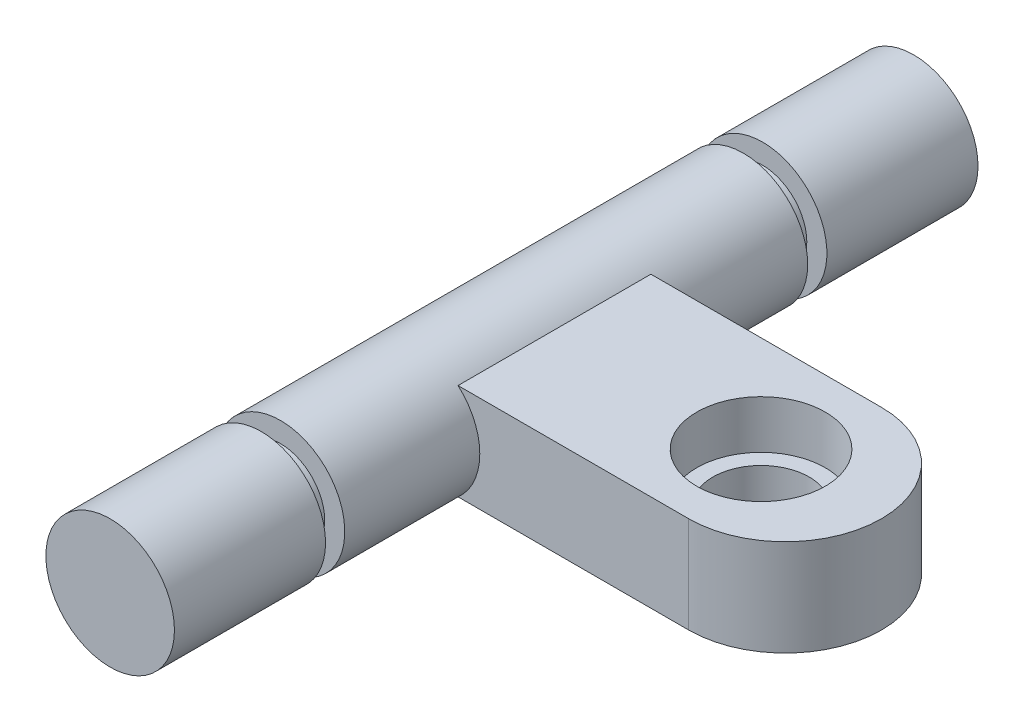
ISO-10303-21;
HEADER;
FILE_DESCRIPTION(('STEP AP214'),'2;1');
FILE_NAME('part.step','',(''),(''),'','','');
FILE_SCHEMA(('AUTOMOTIVE_DESIGN { 1 0 10303 214 1 1 1 1 }'));
ENDSEC;
DATA;
#1=APPLICATION_CONTEXT('core data for automotive mechanical design processes');
#2=APPLICATION_PROTOCOL_DEFINITION('international standard','automotive_design',2000,#1);
#3=PRODUCT_CONTEXT('',#1,'mechanical');
#4=PRODUCT('Part','Part','',(#3));
#5=PRODUCT_RELATED_PRODUCT_CATEGORY('part','',(#4));
#6=PRODUCT_DEFINITION_FORMATION('','',#4);
#7=PRODUCT_DEFINITION_CONTEXT('part definition',#1,'design');
#8=PRODUCT_DEFINITION('design','',#6,#7);
#9=PRODUCT_DEFINITION_SHAPE('','',#8);
#10=(LENGTH_UNIT() NAMED_UNIT(*) SI_UNIT(.MILLI.,.METRE.));
#11=(NAMED_UNIT(*) PLANE_ANGLE_UNIT() SI_UNIT($,.RADIAN.));
#12=(NAMED_UNIT(*) SI_UNIT($,.STERADIAN.) SOLID_ANGLE_UNIT());
#13=UNCERTAINTY_MEASURE_WITH_UNIT(LENGTH_MEASURE(1.E-05),#10,'distance_accuracy_value','');
#14=(GEOMETRIC_REPRESENTATION_CONTEXT(3) GLOBAL_UNCERTAINTY_ASSIGNED_CONTEXT((#13)) GLOBAL_UNIT_ASSIGNED_CONTEXT((#10,
#11,#12)) REPRESENTATION_CONTEXT('',''));
#15=CARTESIAN_POINT('',(0.,0.,0.));
#16=DIRECTION('',(0.,0.,1.));
#17=DIRECTION('',(1.,0.,0.));
#18=AXIS2_PLACEMENT_3D('',#15,#16,#17);
#19=CARTESIAN_POINT('',(-8.5,0.,25.));
#20=DIRECTION('',(0.,0.,-1.));
#21=DIRECTION('',(-1.,0.,0.));
#22=AXIS2_PLACEMENT_3D('',#19,#20,#21);
#23=CYLINDRICAL_SURFACE('',#22,4.);
#24=CARTESIAN_POINT('',(-8.5,0.,-14.402447519915));
#25=DIRECTION('',(0.,0.,1.));
#26=DIRECTION('',(1.,0.,0.));
#27=AXIS2_PLACEMENT_3D('',#24,#25,#26);
#28=CIRCLE('',#27,4.);
#29=CARTESIAN_POINT('',(-4.5,0.,-14.402447519915));
#30=VERTEX_POINT('',#29);
#31=EDGE_CURVE('E38',#30,#30,#28,.T.);
#32=ORIENTED_EDGE('',*,*,#31,.T.);
#33=EDGE_LOOP('',(#32));
#34=FACE_BOUND('',#33,.T.);
#35=DIRECTION('',(0.,0.,-1.));
#36=VECTOR('',#35,1.);
#37=CARTESIAN_POINT('',(-5.85424868893541,-3.,25.));
#38=LINE('',#37,#36);
#39=CARTESIAN_POINT('',(-5.85424868893541,-3.,6.));
#40=VERTEX_POINT('',#39);
#41=CARTESIAN_POINT('',(-5.85424868893541,-3.,-6.));
#42=VERTEX_POINT('',#41);
#43=EDGE_CURVE('E90',#40,#42,#38,.T.);
#44=ORIENTED_EDGE('',*,*,#43,.F.);
#45=CARTESIAN_POINT('',(-8.5,0.,6.));
#46=DIRECTION('',(0.,0.,-1.));
#47=DIRECTION('',(-1.,0.,0.));
#48=AXIS2_PLACEMENT_3D('',#45,#46,#47);
#49=CIRCLE('',#48,4.);
#50=CARTESIAN_POINT('',(-5.85424868893541,3.,6.));
#51=VERTEX_POINT('',#50);
#52=EDGE_CURVE('E58',#40,#51,#49,.F.);
#53=ORIENTED_EDGE('',*,*,#52,.T.);
#54=DIRECTION('',(0.,0.,-1.));
#55=VECTOR('',#54,1.);
#56=CARTESIAN_POINT('',(-5.85424868893541,3.,25.));
#57=LINE('',#56,#55);
#58=CARTESIAN_POINT('',(-5.85424868893541,3.,-6.));
#59=VERTEX_POINT('',#58);
#60=EDGE_CURVE('E51',#51,#59,#57,.T.);
#61=ORIENTED_EDGE('',*,*,#60,.T.);
#62=CARTESIAN_POINT('',(-8.5,0.,-6.));
#63=DIRECTION('',(0.,0.,1.));
#64=DIRECTION('',(1.,0.,0.));
#65=AXIS2_PLACEMENT_3D('',#62,#63,#64);
#66=CIRCLE('',#65,4.);
#67=EDGE_CURVE('E11',#59,#42,#66,.F.);
#68=ORIENTED_EDGE('',*,*,#67,.T.);
#69=EDGE_LOOP('',(#44,#53,#61,#68));
#70=FACE_BOUND('',#69,.T.);
#71=CARTESIAN_POINT('',(-8.5,0.,14.402447519915));
#72=DIRECTION('',(0.,0.,-1.));
#73=DIRECTION('',(-1.,0.,0.));
#74=AXIS2_PLACEMENT_3D('',#71,#72,#73);
#75=CIRCLE('',#74,4.);
#76=CARTESIAN_POINT('',(-12.5,0.,14.402447519915));
#77=VERTEX_POINT('',#76);
#78=EDGE_CURVE('E126',#77,#77,#75,.T.);
#79=ORIENTED_EDGE('',*,*,#78,.T.);
#80=EDGE_LOOP('',(#79));
#81=FACE_BOUND('',#80,.T.);
#82=ADVANCED_FACE('F34',(#34,#70,#81),#23,.T.);
#83=CARTESIAN_POINT('',(8.5,3.,0.));
#84=DIRECTION('',(0.,-1.,0.));
#85=DIRECTION('',(0.,0.,-1.));
#86=AXIS2_PLACEMENT_3D('',#83,#84,#85);
#87=PLANE('',#86);
#88=CARTESIAN_POINT('',(7.,3.,0.));
#89=DIRECTION('',(0.,1.,0.));
#90=DIRECTION('',(0.,0.,1.));
#91=AXIS2_PLACEMENT_3D('',#88,#89,#90);
#92=CIRCLE('',#91,4.);
#93=CARTESIAN_POINT('',(7.,3.,4.));
#94=VERTEX_POINT('',#93);
#95=EDGE_CURVE('E98',#94,#94,#92,.T.);
#96=ORIENTED_EDGE('',*,*,#95,.F.);
#97=EDGE_LOOP('',(#96));
#98=FACE_BOUND('',#97,.T.);
#99=ORIENTED_EDGE('',*,*,#60,.F.);
#100=DIRECTION('',(1.,0.,0.));
#101=VECTOR('',#100,1.);
#102=CARTESIAN_POINT('',(8.5,3.,6.));
#103=LINE('',#102,#101);
#104=CARTESIAN_POINT('',(8.5,3.,6.));
#105=VERTEX_POINT('',#104);
#106=EDGE_CURVE('E86',#51,#105,#103,.T.);
#107=ORIENTED_EDGE('',*,*,#106,.T.);
#108=CARTESIAN_POINT('',(8.5,3.,0.));
#109=DIRECTION('',(0.,1.,0.));
#110=DIRECTION('',(0.,0.,-1.));
#111=AXIS2_PLACEMENT_3D('',#108,#109,#110);
#112=CIRCLE('',#111,6.);
#113=CARTESIAN_POINT('',(8.5,3.,-6.));
#114=VERTEX_POINT('',#113);
#115=EDGE_CURVE('E112',#105,#114,#112,.T.);
#116=ORIENTED_EDGE('',*,*,#115,.T.);
#117=DIRECTION('',(-1.,0.,0.));
#118=VECTOR('',#117,1.);
#119=CARTESIAN_POINT('',(8.5,3.,-6.));
#120=LINE('',#119,#118);
#121=EDGE_CURVE('E114',#114,#59,#120,.T.);
#122=ORIENTED_EDGE('',*,*,#121,.T.);
#123=EDGE_LOOP('',(#99,#107,#116,#122));
#124=FACE_BOUND('',#123,.T.);
#125=ADVANCED_FACE('F173',(#98,#124),#87,.F.);
#126=CARTESIAN_POINT('',(8.5,-3.,0.));
#127=DIRECTION('',(0.,-1.,0.));
#128=DIRECTION('',(0.,0.,-1.));
#129=AXIS2_PLACEMENT_3D('',#126,#127,#128);
#130=PLANE('',#129);
#131=CARTESIAN_POINT('',(7.,-3.,0.));
#132=DIRECTION('',(0.,1.,0.));
#133=DIRECTION('',(0.,0.,1.));
#134=AXIS2_PLACEMENT_3D('',#131,#132,#133);
#135=CIRCLE('',#134,3.);
#136=CARTESIAN_POINT('',(7.,-3.,3.));
#137=VERTEX_POINT('',#136);
#138=EDGE_CURVE('E108',#137,#137,#135,.T.);
#139=ORIENTED_EDGE('',*,*,#138,.T.);
#140=EDGE_LOOP('',(#139));
#141=FACE_BOUND('',#140,.T.);
#142=DIRECTION('',(1.,0.,0.));
#143=VECTOR('',#142,1.);
#144=CARTESIAN_POINT('',(8.5,-3.,6.));
#145=LINE('',#144,#143);
#146=CARTESIAN_POINT('',(8.5,-3.,6.));
#147=VERTEX_POINT('',#146);
#148=EDGE_CURVE('E92',#40,#147,#145,.T.);
#149=ORIENTED_EDGE('',*,*,#148,.F.);
#150=ORIENTED_EDGE('',*,*,#43,.T.);
#151=DIRECTION('',(-1.,0.,0.));
#152=VECTOR('',#151,1.);
#153=CARTESIAN_POINT('',(8.5,-3.,-6.));
#154=LINE('',#153,#152);
#155=CARTESIAN_POINT('',(8.5,-3.,-6.));
#156=VERTEX_POINT('',#155);
#157=EDGE_CURVE('E78',#156,#42,#154,.T.);
#158=ORIENTED_EDGE('',*,*,#157,.F.);
#159=CARTESIAN_POINT('',(8.5,-3.,0.));
#160=DIRECTION('',(0.,1.,0.));
#161=DIRECTION('',(0.,0.,-1.));
#162=AXIS2_PLACEMENT_3D('',#159,#160,#161);
#163=CIRCLE('',#162,6.);
#164=EDGE_CURVE('E87',#147,#156,#163,.T.);
#165=ORIENTED_EDGE('',*,*,#164,.F.);
#166=EDGE_LOOP('',(#149,#150,#158,#165));
#167=FACE_BOUND('',#166,.T.);
#168=ADVANCED_FACE('F91',(#141,#167),#130,.T.);
#169=CARTESIAN_POINT('',(7.,3.,0.));
#170=DIRECTION('',(0.,-1.,0.));
#171=DIRECTION('',(0.,0.,-1.));
#172=AXIS2_PLACEMENT_3D('',#169,#170,#171);
#173=CYLINDRICAL_SURFACE('',#172,3.);
#174=ORIENTED_EDGE('',*,*,#138,.F.);
#175=EDGE_LOOP('',(#174));
#176=FACE_BOUND('',#175,.T.);
#177=CARTESIAN_POINT('',(7.,0.,0.));
#178=DIRECTION('',(0.,1.,0.));
#179=DIRECTION('',(0.,0.,1.));
#180=AXIS2_PLACEMENT_3D('',#177,#178,#179);
#181=CIRCLE('',#180,3.);
#182=CARTESIAN_POINT('',(7.,0.,3.));
#183=VERTEX_POINT('',#182);
#184=EDGE_CURVE('E105',#183,#183,#181,.T.);
#185=ORIENTED_EDGE('',*,*,#184,.T.);
#186=EDGE_LOOP('',(#185));
#187=FACE_BOUND('',#186,.T.);
#188=ADVANCED_FACE('F231',(#176,#187),#173,.F.);
#189=CARTESIAN_POINT('',(8.5,3.,6.));
#190=DIRECTION('',(0.,0.,-1.));
#191=DIRECTION('',(-1.,0.,0.));
#192=AXIS2_PLACEMENT_3D('',#189,#190,#191);
#193=PLANE('',#192);
#194=ORIENTED_EDGE('',*,*,#52,.F.);
#195=ORIENTED_EDGE('',*,*,#148,.T.);
#196=DIRECTION('',(0.,-1.,0.));
#197=VECTOR('',#196,1.);
#198=CARTESIAN_POINT('',(8.5,3.,6.));
#199=LINE('',#198,#197);
#200=EDGE_CURVE('E43',#105,#147,#199,.T.);
#201=ORIENTED_EDGE('',*,*,#200,.F.);
#202=ORIENTED_EDGE('',*,*,#106,.F.);
#203=EDGE_LOOP('',(#194,#195,#201,#202));
#204=FACE_BOUND('',#203,.T.);
#205=ADVANCED_FACE('F36',(#204),#193,.F.);
#206=CARTESIAN_POINT('',(8.5,3.,0.));
#207=DIRECTION('',(0.,-1.,0.));
#208=DIRECTION('',(0.,0.,-1.));
#209=AXIS2_PLACEMENT_3D('',#206,#207,#208);
#210=CYLINDRICAL_SURFACE('',#209,6.);
#211=ORIENTED_EDGE('',*,*,#164,.T.);
#212=DIRECTION('',(0.,-1.,0.));
#213=VECTOR('',#212,1.);
#214=CARTESIAN_POINT('',(8.5,3.,-6.));
#215=LINE('',#214,#213);
#216=EDGE_CURVE('E83',#114,#156,#215,.T.);
#217=ORIENTED_EDGE('',*,*,#216,.F.);
#218=ORIENTED_EDGE('',*,*,#115,.F.);
#219=ORIENTED_EDGE('',*,*,#200,.T.);
#220=EDGE_LOOP('',(#211,#217,#218,#219));
#221=FACE_BOUND('',#220,.T.);
#222=ADVANCED_FACE('F239',(#221),#210,.T.);
#223=CARTESIAN_POINT('',(8.5,3.,-6.));
#224=DIRECTION('',(0.,0.,1.));
#225=DIRECTION('',(1.,0.,0.));
#226=AXIS2_PLACEMENT_3D('',#223,#224,#225);
#227=PLANE('',#226);
#228=ORIENTED_EDGE('',*,*,#67,.F.);
#229=ORIENTED_EDGE('',*,*,#121,.F.);
#230=ORIENTED_EDGE('',*,*,#216,.T.);
#231=ORIENTED_EDGE('',*,*,#157,.T.);
#232=EDGE_LOOP('',(#228,#229,#230,#231));
#233=FACE_BOUND('',#232,.T.);
#234=ADVANCED_FACE('F80',(#233),#227,.F.);
#235=CARTESIAN_POINT('',(7.,0.,0.));
#236=DIRECTION('',(0.,1.,0.));
#237=DIRECTION('',(0.,0.,1.));
#238=AXIS2_PLACEMENT_3D('',#235,#236,#237);
#239=CYLINDRICAL_SURFACE('',#238,4.);
#240=CARTESIAN_POINT('',(7.,0.,0.));
#241=DIRECTION('',(0.,1.,0.));
#242=DIRECTION('',(0.,0.,1.));
#243=AXIS2_PLACEMENT_3D('',#240,#241,#242);
#244=CIRCLE('',#243,4.);
#245=CARTESIAN_POINT('',(7.,0.,4.));
#246=VERTEX_POINT('',#245);
#247=EDGE_CURVE('E102',#246,#246,#244,.T.);
#248=ORIENTED_EDGE('',*,*,#247,.F.);
#249=EDGE_LOOP('',(#248));
#250=FACE_BOUND('',#249,.T.);
#251=ORIENTED_EDGE('',*,*,#95,.T.);
#252=EDGE_LOOP('',(#251));
#253=FACE_BOUND('',#252,.T.);
#254=ADVANCED_FACE('F221',(#250,#253),#239,.F.);
#255=CARTESIAN_POINT('',(7.,0.,0.));
#256=DIRECTION('',(0.,1.,0.));
#257=DIRECTION('',(0.,0.,1.));
#258=AXIS2_PLACEMENT_3D('',#255,#256,#257);
#259=PLANE('',#258);
#260=ORIENTED_EDGE('',*,*,#184,.F.);
#261=EDGE_LOOP('',(#260));
#262=FACE_BOUND('',#261,.T.);
#263=ORIENTED_EDGE('',*,*,#247,.T.);
#264=EDGE_LOOP('',(#263));
#265=FACE_BOUND('',#264,.T.);
#266=ADVANCED_FACE('F210',(#262,#265),#259,.T.);
#267=CARTESIAN_POINT('',(-3.24999999999999,0.,14.402447519915));
#268=DIRECTION('',(0.,0.,-1.));
#269=DIRECTION('',(-1.,0.,0.));
#270=AXIS2_PLACEMENT_3D('',#267,#268,#269);
#271=PLANE('',#270);
#272=CARTESIAN_POINT('',(-8.5,0.,14.402447519915));
#273=DIRECTION('',(0.,0.,1.));
#274=DIRECTION('',(1.,0.,0.));
#275=AXIS2_PLACEMENT_3D('',#272,#273,#274);
#276=CIRCLE('',#275,2.75);
#277=CARTESIAN_POINT('',(-5.75,0.,14.402447519915));
#278=VERTEX_POINT('',#277);
#279=EDGE_CURVE('E143',#278,#278,#276,.T.);
#280=ORIENTED_EDGE('',*,*,#279,.F.);
#281=EDGE_LOOP('',(#280));
#282=FACE_BOUND('',#281,.T.);
#283=ORIENTED_EDGE('',*,*,#78,.F.);
#284=EDGE_LOOP('',(#283));
#285=FACE_BOUND('',#284,.T.);
#286=ADVANCED_FACE('F201',(#282,#285),#271,.F.);
#287=CARTESIAN_POINT('',(-3.24999999999999,0.,15.597552480085));
#288=DIRECTION('',(0.,0.,1.));
#289=DIRECTION('',(1.,0.,0.));
#290=AXIS2_PLACEMENT_3D('',#287,#288,#289);
#291=PLANE('',#290);
#292=CARTESIAN_POINT('',(-8.5,0.,15.597552480085));
#293=DIRECTION('',(0.,0.,1.));
#294=DIRECTION('',(1.,0.,0.));
#295=AXIS2_PLACEMENT_3D('',#292,#293,#294);
#296=CIRCLE('',#295,2.75);
#297=CARTESIAN_POINT('',(-5.75,0.,15.597552480085));
#298=VERTEX_POINT('',#297);
#299=EDGE_CURVE('E147',#298,#298,#296,.T.);
#300=ORIENTED_EDGE('',*,*,#299,.T.);
#301=EDGE_LOOP('',(#300));
#302=FACE_BOUND('',#301,.T.);
#303=CARTESIAN_POINT('',(-8.5,0.,15.597552480085));
#304=DIRECTION('',(0.,0.,1.));
#305=DIRECTION('',(1.,0.,0.));
#306=AXIS2_PLACEMENT_3D('',#303,#304,#305);
#307=CIRCLE('',#306,4.);
#308=CARTESIAN_POINT('',(-4.5,0.,15.597552480085));
#309=VERTEX_POINT('',#308);
#310=EDGE_CURVE('E123',#309,#309,#307,.T.);
#311=ORIENTED_EDGE('',*,*,#310,.F.);
#312=EDGE_LOOP('',(#311));
#313=FACE_BOUND('',#312,.T.);
#314=ADVANCED_FACE('F199',(#302,#313),#291,.F.);
#315=CARTESIAN_POINT('',(-8.5,0.,25.));
#316=DIRECTION('',(0.,0.,1.));
#317=DIRECTION('',(1.,0.,0.));
#318=AXIS2_PLACEMENT_3D('',#315,#316,#317);
#319=CYLINDRICAL_SURFACE('',#318,2.75);
#320=ORIENTED_EDGE('',*,*,#299,.F.);
#321=EDGE_LOOP('',(#320));
#322=FACE_BOUND('',#321,.T.);
#323=ORIENTED_EDGE('',*,*,#279,.T.);
#324=EDGE_LOOP('',(#323));
#325=FACE_BOUND('',#324,.T.);
#326=ADVANCED_FACE('F169',(#322,#325),#319,.T.);
#327=CARTESIAN_POINT('',(-3.25,0.,-14.402447519915));
#328=DIRECTION('',(0.,0.,1.));
#329=DIRECTION('',(1.,0.,0.));
#330=AXIS2_PLACEMENT_3D('',#327,#328,#329);
#331=PLANE('',#330);
#332=CARTESIAN_POINT('',(-8.5,0.,-14.402447519915));
#333=DIRECTION('',(0.,0.,1.));
#334=DIRECTION('',(1.,0.,0.));
#335=AXIS2_PLACEMENT_3D('',#332,#333,#334);
#336=CIRCLE('',#335,2.75);
#337=CARTESIAN_POINT('',(-5.75,0.,-14.402447519915));
#338=VERTEX_POINT('',#337);
#339=EDGE_CURVE('E127',#338,#338,#336,.T.);
#340=ORIENTED_EDGE('',*,*,#339,.T.);
#341=EDGE_LOOP('',(#340));
#342=FACE_BOUND('',#341,.T.);
#343=ORIENTED_EDGE('',*,*,#31,.F.);
#344=EDGE_LOOP('',(#343));
#345=FACE_BOUND('',#344,.T.);
#346=ADVANCED_FACE('F160',(#342,#345),#331,.F.);
#347=CARTESIAN_POINT('',(-3.24999999999999,0.,-15.597552480085));
#348=DIRECTION('',(0.,0.,-1.));
#349=DIRECTION('',(-1.,0.,0.));
#350=AXIS2_PLACEMENT_3D('',#347,#348,#349);
#351=PLANE('',#350);
#352=CARTESIAN_POINT('',(-8.5,0.,-15.597552480085));
#353=DIRECTION('',(0.,0.,1.));
#354=DIRECTION('',(1.,0.,0.));
#355=AXIS2_PLACEMENT_3D('',#352,#353,#354);
#356=CIRCLE('',#355,2.74999999999999);
#357=CARTESIAN_POINT('',(-5.75000000000001,0.,-15.597552480085));
#358=VERTEX_POINT('',#357);
#359=EDGE_CURVE('E146',#358,#358,#356,.T.);
#360=ORIENTED_EDGE('',*,*,#359,.F.);
#361=EDGE_LOOP('',(#360));
#362=FACE_BOUND('',#361,.T.);
#363=CARTESIAN_POINT('',(-8.5,0.,-15.597552480085));
#364=DIRECTION('',(0.,0.,-1.));
#365=DIRECTION('',(-1.,0.,0.));
#366=AXIS2_PLACEMENT_3D('',#363,#364,#365);
#367=CIRCLE('',#366,4.);
#368=CARTESIAN_POINT('',(-12.5,0.,-15.597552480085));
#369=VERTEX_POINT('',#368);
#370=EDGE_CURVE('E129',#369,#369,#367,.T.);
#371=ORIENTED_EDGE('',*,*,#370,.F.);
#372=EDGE_LOOP('',(#371));
#373=FACE_BOUND('',#372,.T.);
#374=ADVANCED_FACE('F157',(#362,#373),#351,.F.);
#375=CARTESIAN_POINT('',(-8.5,0.,25.));
#376=DIRECTION('',(0.,0.,1.));
#377=DIRECTION('',(1.,0.,0.));
#378=AXIS2_PLACEMENT_3D('',#375,#376,#377);
#379=CYLINDRICAL_SURFACE('',#378,2.75);
#380=ORIENTED_EDGE('',*,*,#339,.F.);
#381=EDGE_LOOP('',(#380));
#382=FACE_BOUND('',#381,.T.);
#383=ORIENTED_EDGE('',*,*,#359,.T.);
#384=EDGE_LOOP('',(#383));
#385=FACE_BOUND('',#384,.T.);
#386=ADVANCED_FACE('F155',(#382,#385),#379,.T.);
#387=CARTESIAN_POINT('',(-8.5,0.,25.));
#388=DIRECTION('',(0.,0.,1.));
#389=DIRECTION('',(1.,0.,0.));
#390=AXIS2_PLACEMENT_3D('',#387,#388,#389);
#391=PLANE('',#390);
#392=CARTESIAN_POINT('',(-8.5,0.,25.));
#393=DIRECTION('',(0.,0.,1.));
#394=DIRECTION('',(1.,0.,0.));
#395=AXIS2_PLACEMENT_3D('',#392,#393,#394);
#396=CIRCLE('',#395,4.);
#397=CARTESIAN_POINT('',(-4.5,0.,25.));
#398=VERTEX_POINT('',#397);
#399=EDGE_CURVE('E94',#398,#398,#396,.T.);
#400=ORIENTED_EDGE('',*,*,#399,.T.);
#401=EDGE_LOOP('',(#400));
#402=FACE_BOUND('',#401,.T.);
#403=ADVANCED_FACE('F166',(#402),#391,.T.);
#404=ORIENTED_EDGE('',*,*,#310,.T.);
#405=EDGE_LOOP('',(#404));
#406=FACE_BOUND('',#405,.T.);
#407=ORIENTED_EDGE('',*,*,#399,.F.);
#408=EDGE_LOOP('',(#407));
#409=FACE_BOUND('',#408,.T.);
#410=ADVANCED_FACE('F176',(#406,#409),#23,.T.);
#411=CARTESIAN_POINT('',(-8.5,0.,-25.));
#412=DIRECTION('',(0.,0.,1.));
#413=DIRECTION('',(1.,0.,0.));
#414=AXIS2_PLACEMENT_3D('',#411,#412,#413);
#415=PLANE('',#414);
#416=CARTESIAN_POINT('',(-8.5,0.,-25.));
#417=DIRECTION('',(0.,0.,1.));
#418=DIRECTION('',(1.,0.,0.));
#419=AXIS2_PLACEMENT_3D('',#416,#417,#418);
#420=CIRCLE('',#419,4.);
#421=CARTESIAN_POINT('',(-4.5,0.,-25.));
#422=VERTEX_POINT('',#421);
#423=EDGE_CURVE('E134',#422,#422,#420,.T.);
#424=ORIENTED_EDGE('',*,*,#423,.F.);
#425=EDGE_LOOP('',(#424));
#426=FACE_BOUND('',#425,.T.);
#427=ADVANCED_FACE('F185',(#426),#415,.F.);
#428=ORIENTED_EDGE('',*,*,#370,.T.);
#429=EDGE_LOOP('',(#428));
#430=FACE_BOUND('',#429,.T.);
#431=ORIENTED_EDGE('',*,*,#423,.T.);
#432=EDGE_LOOP('',(#431));
#433=FACE_BOUND('',#432,.T.);
#434=ADVANCED_FACE('F175',(#430,#433),#23,.T.);
#435=CLOSED_SHELL('',(#82,#125,#168,#188,#205,#222,#234,#254,#266,#286,#314,#326,#346,#374,#386,
#403,#410,#427,#434));
#436=MANIFOLD_SOLID_BREP('B2',#435);
#437=ADVANCED_BREP_SHAPE_REPRESENTATION('',(#18,#436),#14);
#438=SHAPE_DEFINITION_REPRESENTATION(#9,#437);
ENDSEC;
END-ISO-10303-21;
